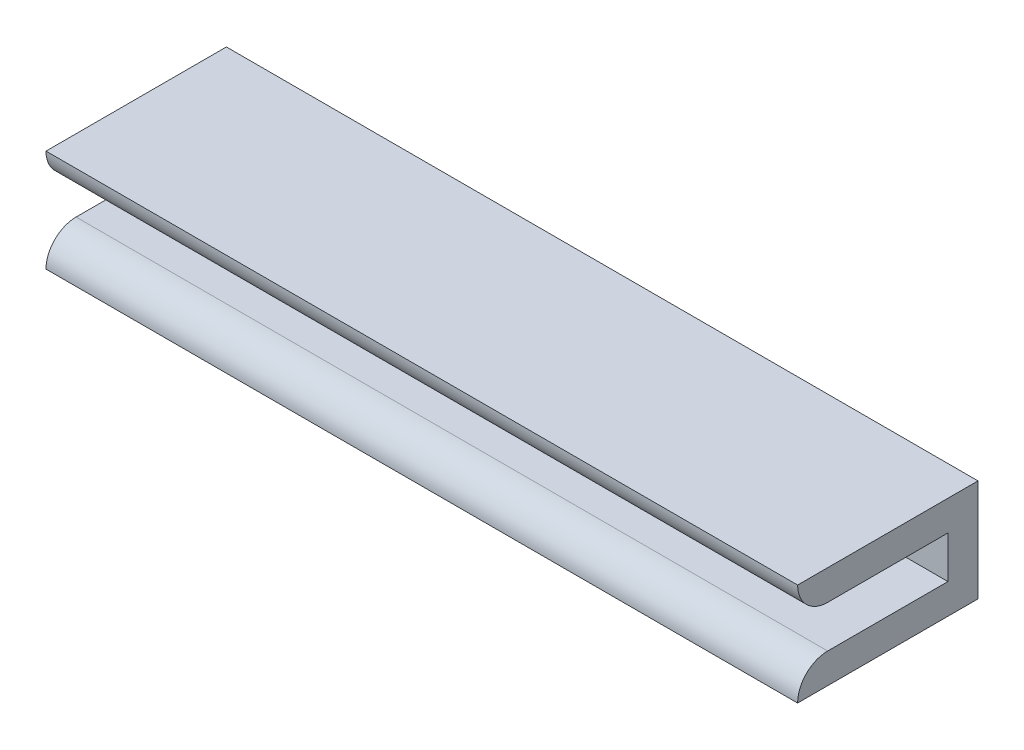
ISO-10303-21;
HEADER;
FILE_DESCRIPTION(('STEP AP214'),'2;1');
FILE_NAME('part.step','',(''),(''),'','','');
FILE_SCHEMA(('AUTOMOTIVE_DESIGN { 1 0 10303 214 1 1 1 1 }'));
ENDSEC;
DATA;
#1=APPLICATION_CONTEXT('core data for automotive mechanical design processes');
#2=APPLICATION_PROTOCOL_DEFINITION('international standard','automotive_design',2000,#1);
#3=PRODUCT_CONTEXT('',#1,'mechanical');
#4=PRODUCT('Part','Part','',(#3));
#5=PRODUCT_RELATED_PRODUCT_CATEGORY('part','',(#4));
#6=PRODUCT_DEFINITION_FORMATION('','',#4);
#7=PRODUCT_DEFINITION_CONTEXT('part definition',#1,'design');
#8=PRODUCT_DEFINITION('design','',#6,#7);
#9=PRODUCT_DEFINITION_SHAPE('','',#8);
#10=(LENGTH_UNIT() NAMED_UNIT(*) SI_UNIT(.MILLI.,.METRE.));
#11=(NAMED_UNIT(*) PLANE_ANGLE_UNIT() SI_UNIT($,.RADIAN.));
#12=(NAMED_UNIT(*) SI_UNIT($,.STERADIAN.) SOLID_ANGLE_UNIT());
#13=UNCERTAINTY_MEASURE_WITH_UNIT(LENGTH_MEASURE(1.E-05),#10,'distance_accuracy_value','');
#14=(GEOMETRIC_REPRESENTATION_CONTEXT(3) GLOBAL_UNCERTAINTY_ASSIGNED_CONTEXT((#13)) GLOBAL_UNIT_ASSIGNED_CONTEXT((#10,
#11,#12)) REPRESENTATION_CONTEXT('',''));
#15=CARTESIAN_POINT('',(0.,0.,0.));
#16=DIRECTION('',(0.,0.,1.));
#17=DIRECTION('',(1.,0.,0.));
#18=AXIS2_PLACEMENT_3D('',#15,#16,#17);
#19=CARTESIAN_POINT('',(0.,0.,0.));
#20=DIRECTION('',(0.,0.,-1.));
#21=DIRECTION('',(-1.,0.,0.));
#22=AXIS2_PLACEMENT_3D('',#19,#20,#21);
#23=PLANE('',#22);
#24=DIRECTION('',(-1.,0.,0.));
#25=VECTOR('',#24,1.);
#26=CARTESIAN_POINT('',(0.,-2.8,0.));
#27=LINE('',#26,#25);
#28=CARTESIAN_POINT('',(50.,-2.8,0.));
#29=VERTEX_POINT('',#28);
#30=CARTESIAN_POINT('',(0.,-2.8,0.));
#31=VERTEX_POINT('',#30);
#32=EDGE_CURVE('E125',#29,#31,#27,.T.);
#33=ORIENTED_EDGE('',*,*,#32,.F.);
#34=DIRECTION('',(0.,-1.,0.));
#35=VECTOR('',#34,1.);
#36=CARTESIAN_POINT('',(50.,2.,0.));
#37=LINE('',#36,#35);
#38=CARTESIAN_POINT('',(50.,0.,0.));
#39=VERTEX_POINT('',#38);
#40=EDGE_CURVE('E131',#39,#29,#37,.T.);
#41=ORIENTED_EDGE('',*,*,#40,.F.);
#42=DIRECTION('',(1.,0.,0.));
#43=VECTOR('',#42,1.);
#44=CARTESIAN_POINT('',(0.,0.,0.));
#45=LINE('',#44,#43);
#46=CARTESIAN_POINT('',(0.,0.,0.));
#47=VERTEX_POINT('',#46);
#48=EDGE_CURVE('E128',#47,#39,#45,.T.);
#49=ORIENTED_EDGE('',*,*,#48,.F.);
#50=DIRECTION('',(0.,1.,0.));
#51=VECTOR('',#50,1.);
#52=CARTESIAN_POINT('',(0.,2.,0.));
#53=LINE('',#52,#51);
#54=EDGE_CURVE('E114',#31,#47,#53,.T.);
#55=ORIENTED_EDGE('',*,*,#54,.F.);
#56=EDGE_LOOP('',(#33,#41,#49,#55));
#57=FACE_BOUND('',#56,.T.);
#58=ADVANCED_FACE('F44',(#57),#23,.F.);
#59=CARTESIAN_POINT('',(0.,0.,10.));
#60=DIRECTION('',(1.,0.,0.));
#61=DIRECTION('',(0.,0.,-1.));
#62=AXIS2_PLACEMENT_3D('',#59,#60,#61);
#63=PLANE('',#62);
#64=DIRECTION('',(0.,0.,1.));
#65=VECTOR('',#64,1.);
#66=CARTESIAN_POINT('',(0.,-4.8,-2.));
#67=LINE('',#66,#65);
#68=CARTESIAN_POINT('',(0.,-4.8,-2.));
#69=VERTEX_POINT('',#68);
#70=CARTESIAN_POINT('',(0.,-4.8,10.));
#71=VERTEX_POINT('',#70);
#72=EDGE_CURVE('E156',#69,#71,#67,.T.);
#73=ORIENTED_EDGE('',*,*,#72,.T.);
#74=CARTESIAN_POINT('',(0.,-4.8,8.));
#75=DIRECTION('',(1.,0.,0.));
#76=DIRECTION('',(0.,0.,-1.));
#77=AXIS2_PLACEMENT_3D('',#74,#75,#76);
#78=CIRCLE('',#77,2.);
#79=CARTESIAN_POINT('',(0.,-2.8,8.));
#80=VERTEX_POINT('',#79);
#81=EDGE_CURVE('E116',#71,#80,#78,.F.);
#82=ORIENTED_EDGE('',*,*,#81,.T.);
#83=DIRECTION('',(0.,0.,-1.));
#84=VECTOR('',#83,1.);
#85=CARTESIAN_POINT('',(0.,-2.8,10.));
#86=LINE('',#85,#84);
#87=EDGE_CURVE('E109',#80,#31,#86,.T.);
#88=ORIENTED_EDGE('',*,*,#87,.T.);
#89=ORIENTED_EDGE('',*,*,#54,.T.);
#90=DIRECTION('',(0.,0.,-1.));
#91=VECTOR('',#90,1.);
#92=CARTESIAN_POINT('',(0.,0.,10.));
#93=LINE('',#92,#91);
#94=CARTESIAN_POINT('',(0.,0.,8.));
#95=VERTEX_POINT('',#94);
#96=EDGE_CURVE('E179',#95,#47,#93,.T.);
#97=ORIENTED_EDGE('',*,*,#96,.F.);
#98=CARTESIAN_POINT('',(0.,2.,8.));
#99=DIRECTION('',(1.,0.,0.));
#100=DIRECTION('',(0.,0.,-1.));
#101=AXIS2_PLACEMENT_3D('',#98,#99,#100);
#102=CIRCLE('',#101,2.);
#103=CARTESIAN_POINT('',(0.,2.,10.));
#104=VERTEX_POINT('',#103);
#105=EDGE_CURVE('E182',#95,#104,#102,.F.);
#106=ORIENTED_EDGE('',*,*,#105,.T.);
#107=DIRECTION('',(0.,0.,-1.));
#108=VECTOR('',#107,1.);
#109=CARTESIAN_POINT('',(0.,2.,10.));
#110=LINE('',#109,#108);
#111=CARTESIAN_POINT('',(0.,2.,-2.));
#112=VERTEX_POINT('',#111);
#113=EDGE_CURVE('E168',#104,#112,#110,.T.);
#114=ORIENTED_EDGE('',*,*,#113,.T.);
#115=DIRECTION('',(0.,1.,0.));
#116=VECTOR('',#115,1.);
#117=CARTESIAN_POINT('',(0.,2.,-2.));
#118=LINE('',#117,#116);
#119=EDGE_CURVE('E149',#69,#112,#118,.T.);
#120=ORIENTED_EDGE('',*,*,#119,.F.);
#121=EDGE_LOOP('',(#73,#82,#88,#89,#97,#106,#114,#120));
#122=FACE_BOUND('',#121,.T.);
#123=ADVANCED_FACE('F112',(#122),#63,.F.);
#124=CARTESIAN_POINT('',(0.,0.,10.));
#125=DIRECTION('',(0.,1.,0.));
#126=DIRECTION('',(0.,0.,1.));
#127=AXIS2_PLACEMENT_3D('',#124,#125,#126);
#128=PLANE('',#127);
#129=DIRECTION('',(0.,0.,-1.));
#130=VECTOR('',#129,1.);
#131=CARTESIAN_POINT('',(50.,0.,10.));
#132=LINE('',#131,#130);
#133=CARTESIAN_POINT('',(50.,0.,8.));
#134=VERTEX_POINT('',#133);
#135=EDGE_CURVE('E176',#134,#39,#132,.T.);
#136=ORIENTED_EDGE('',*,*,#135,.F.);
#137=DIRECTION('',(1.,0.,0.));
#138=VECTOR('',#137,1.);
#139=CARTESIAN_POINT('',(0.,0.,8.));
#140=LINE('',#139,#138);
#141=EDGE_CURVE('E11',#134,#95,#140,.F.);
#142=ORIENTED_EDGE('',*,*,#141,.T.);
#143=ORIENTED_EDGE('',*,*,#96,.T.);
#144=ORIENTED_EDGE('',*,*,#48,.T.);
#145=EDGE_LOOP('',(#136,#142,#143,#144));
#146=FACE_BOUND('',#145,.T.);
#147=ADVANCED_FACE('F213',(#146),#128,.F.);
#148=CARTESIAN_POINT('',(50.,0.,10.));
#149=DIRECTION('',(-1.,0.,0.));
#150=DIRECTION('',(0.,0.,1.));
#151=AXIS2_PLACEMENT_3D('',#148,#149,#150);
#152=PLANE('',#151);
#153=DIRECTION('',(0.,0.,-1.));
#154=VECTOR('',#153,1.);
#155=CARTESIAN_POINT('',(50.,-2.8,10.));
#156=LINE('',#155,#154);
#157=CARTESIAN_POINT('',(50.,-2.8,8.));
#158=VERTEX_POINT('',#157);
#159=EDGE_CURVE('E120',#158,#29,#156,.T.);
#160=ORIENTED_EDGE('',*,*,#159,.F.);
#161=CARTESIAN_POINT('',(50.,-4.8,8.));
#162=DIRECTION('',(-1.,0.,0.));
#163=DIRECTION('',(0.,0.,1.));
#164=AXIS2_PLACEMENT_3D('',#161,#162,#163);
#165=CIRCLE('',#164,2.);
#166=CARTESIAN_POINT('',(50.,-4.8,10.));
#167=VERTEX_POINT('',#166);
#168=EDGE_CURVE('E53',#158,#167,#165,.F.);
#169=ORIENTED_EDGE('',*,*,#168,.T.);
#170=DIRECTION('',(0.,0.,1.));
#171=VECTOR('',#170,1.);
#172=CARTESIAN_POINT('',(50.,-4.8,-2.));
#173=LINE('',#172,#171);
#174=CARTESIAN_POINT('',(50.,-4.8,-2.));
#175=VERTEX_POINT('',#174);
#176=EDGE_CURVE('E160',#175,#167,#173,.T.);
#177=ORIENTED_EDGE('',*,*,#176,.F.);
#178=DIRECTION('',(0.,-1.,0.));
#179=VECTOR('',#178,1.);
#180=CARTESIAN_POINT('',(50.,2.,-2.));
#181=LINE('',#180,#179);
#182=CARTESIAN_POINT('',(50.,2.,-2.));
#183=VERTEX_POINT('',#182);
#184=EDGE_CURVE('E130',#183,#175,#181,.T.);
#185=ORIENTED_EDGE('',*,*,#184,.F.);
#186=DIRECTION('',(0.,0.,-1.));
#187=VECTOR('',#186,1.);
#188=CARTESIAN_POINT('',(50.,2.,10.));
#189=LINE('',#188,#187);
#190=CARTESIAN_POINT('',(50.,2.,10.));
#191=VERTEX_POINT('',#190);
#192=EDGE_CURVE('E173',#191,#183,#189,.T.);
#193=ORIENTED_EDGE('',*,*,#192,.F.);
#194=CARTESIAN_POINT('',(50.,2.,8.));
#195=DIRECTION('',(-1.,0.,0.));
#196=DIRECTION('',(0.,0.,1.));
#197=AXIS2_PLACEMENT_3D('',#194,#195,#196);
#198=CIRCLE('',#197,2.);
#199=EDGE_CURVE('E60',#191,#134,#198,.F.);
#200=ORIENTED_EDGE('',*,*,#199,.T.);
#201=ORIENTED_EDGE('',*,*,#135,.T.);
#202=ORIENTED_EDGE('',*,*,#40,.T.);
#203=EDGE_LOOP('',(#160,#169,#177,#185,#193,#200,#201,#202));
#204=FACE_BOUND('',#203,.T.);
#205=ADVANCED_FACE('F193',(#204),#152,.F.);
#206=CARTESIAN_POINT('',(0.,2.,10.));
#207=DIRECTION('',(0.,-1.,0.));
#208=DIRECTION('',(0.,0.,-1.));
#209=AXIS2_PLACEMENT_3D('',#206,#207,#208);
#210=PLANE('',#209);
#211=ORIENTED_EDGE('',*,*,#192,.T.);
#212=DIRECTION('',(1.,0.,0.));
#213=VECTOR('',#212,1.);
#214=CARTESIAN_POINT('',(50.,2.,-2.));
#215=LINE('',#214,#213);
#216=EDGE_CURVE('E153',#112,#183,#215,.T.);
#217=ORIENTED_EDGE('',*,*,#216,.F.);
#218=ORIENTED_EDGE('',*,*,#113,.F.);
#219=DIRECTION('',(-1.,0.,0.));
#220=VECTOR('',#219,1.);
#221=CARTESIAN_POINT('',(0.,2.,10.));
#222=LINE('',#221,#220);
#223=EDGE_CURVE('E164',#191,#104,#222,.T.);
#224=ORIENTED_EDGE('',*,*,#223,.F.);
#225=EDGE_LOOP('',(#211,#217,#218,#224));
#226=FACE_BOUND('',#225,.T.);
#227=ADVANCED_FACE('F207',(#226),#210,.F.);
#228=CARTESIAN_POINT('',(50.,-4.8,-2.));
#229=DIRECTION('',(0.,1.,0.));
#230=DIRECTION('',(0.,0.,1.));
#231=AXIS2_PLACEMENT_3D('',#228,#229,#230);
#232=PLANE('',#231);
#233=ORIENTED_EDGE('',*,*,#176,.T.);
#234=DIRECTION('',(1.,0.,0.));
#235=VECTOR('',#234,1.);
#236=CARTESIAN_POINT('',(0.,-4.8,10.));
#237=LINE('',#236,#235);
#238=EDGE_CURVE('E119',#71,#167,#237,.T.);
#239=ORIENTED_EDGE('',*,*,#238,.F.);
#240=ORIENTED_EDGE('',*,*,#72,.F.);
#241=DIRECTION('',(-1.,0.,0.));
#242=VECTOR('',#241,1.);
#243=CARTESIAN_POINT('',(50.,-4.8,-2.));
#244=LINE('',#243,#242);
#245=EDGE_CURVE('E146',#175,#69,#244,.T.);
#246=ORIENTED_EDGE('',*,*,#245,.F.);
#247=EDGE_LOOP('',(#233,#239,#240,#246));
#248=FACE_BOUND('',#247,.T.);
#249=ADVANCED_FACE('F198',(#248),#232,.F.);
#250=CARTESIAN_POINT('',(0.,0.,-2.));
#251=DIRECTION('',(0.,0.,-1.));
#252=DIRECTION('',(-1.,0.,0.));
#253=AXIS2_PLACEMENT_3D('',#250,#251,#252);
#254=PLANE('',#253);
#255=ORIENTED_EDGE('',*,*,#184,.T.);
#256=ORIENTED_EDGE('',*,*,#245,.T.);
#257=ORIENTED_EDGE('',*,*,#119,.T.);
#258=ORIENTED_EDGE('',*,*,#216,.T.);
#259=EDGE_LOOP('',(#255,#256,#257,#258));
#260=FACE_BOUND('',#259,.T.);
#261=ADVANCED_FACE('F205',(#260),#254,.T.);
#262=CARTESIAN_POINT('',(0.,-2.8,10.));
#263=DIRECTION('',(0.,-1.,0.));
#264=DIRECTION('',(0.,0.,-1.));
#265=AXIS2_PLACEMENT_3D('',#262,#263,#264);
#266=PLANE('',#265);
#267=ORIENTED_EDGE('',*,*,#87,.F.);
#268=DIRECTION('',(-1.,0.,0.));
#269=VECTOR('',#268,1.);
#270=CARTESIAN_POINT('',(50.,-2.8,8.));
#271=LINE('',#270,#269);
#272=EDGE_CURVE('E68',#80,#158,#271,.F.);
#273=ORIENTED_EDGE('',*,*,#272,.T.);
#274=ORIENTED_EDGE('',*,*,#159,.T.);
#275=ORIENTED_EDGE('',*,*,#32,.T.);
#276=EDGE_LOOP('',(#267,#273,#274,#275));
#277=FACE_BOUND('',#276,.T.);
#278=ADVANCED_FACE('F133',(#277),#266,.F.);
#279=CARTESIAN_POINT('',(0.,-4.8,8.));
#280=DIRECTION('',(1.,0.,0.));
#281=DIRECTION('',(0.,0.,-1.));
#282=AXIS2_PLACEMENT_3D('',#279,#280,#281);
#283=CYLINDRICAL_SURFACE('',#282,2.);
#284=ORIENTED_EDGE('',*,*,#168,.F.);
#285=ORIENTED_EDGE('',*,*,#272,.F.);
#286=ORIENTED_EDGE('',*,*,#81,.F.);
#287=ORIENTED_EDGE('',*,*,#238,.T.);
#288=EDGE_LOOP('',(#284,#285,#286,#287));
#289=FACE_BOUND('',#288,.T.);
#290=ADVANCED_FACE('F200',(#289),#283,.T.);
#291=CARTESIAN_POINT('',(0.,2.,8.));
#292=DIRECTION('',(1.,0.,0.));
#293=DIRECTION('',(0.,0.,-1.));
#294=AXIS2_PLACEMENT_3D('',#291,#292,#293);
#295=CYLINDRICAL_SURFACE('',#294,2.);
#296=ORIENTED_EDGE('',*,*,#105,.F.);
#297=ORIENTED_EDGE('',*,*,#141,.F.);
#298=ORIENTED_EDGE('',*,*,#199,.F.);
#299=ORIENTED_EDGE('',*,*,#223,.T.);
#300=EDGE_LOOP('',(#296,#297,#298,#299));
#301=FACE_BOUND('',#300,.T.);
#302=ADVANCED_FACE('F46',(#301),#295,.T.);
#303=CLOSED_SHELL('',(#58,#123,#147,#205,#227,#249,#261,#278,#290,#302));
#304=MANIFOLD_SOLID_BREP('B2',#303);
#305=ADVANCED_BREP_SHAPE_REPRESENTATION('',(#18,#304),#14);
#306=SHAPE_DEFINITION_REPRESENTATION(#9,#305);
ENDSEC;
END-ISO-10303-21;
